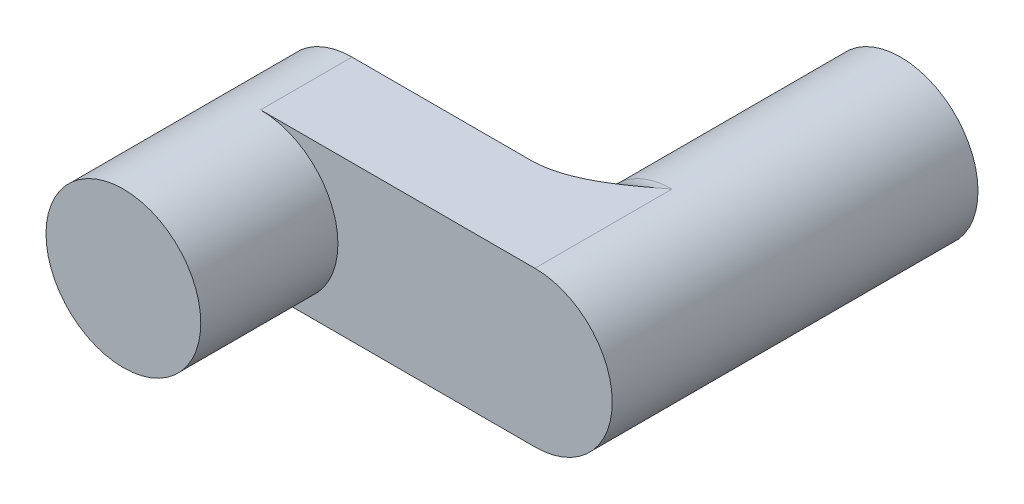
ISO-10303-21;
HEADER;
FILE_DESCRIPTION(('STEP AP214'),'2;1');
FILE_NAME('part.step','',(''),(''),'','','');
FILE_SCHEMA(('AUTOMOTIVE_DESIGN { 1 0 10303 214 1 1 1 1 }'));
ENDSEC;
DATA;
#1=APPLICATION_CONTEXT('core data for automotive mechanical design processes');
#2=APPLICATION_PROTOCOL_DEFINITION('international standard','automotive_design',2000,#1);
#3=PRODUCT_CONTEXT('',#1,'mechanical');
#4=PRODUCT('Part','Part','',(#3));
#5=PRODUCT_RELATED_PRODUCT_CATEGORY('part','',(#4));
#6=PRODUCT_DEFINITION_FORMATION('','',#4);
#7=PRODUCT_DEFINITION_CONTEXT('part definition',#1,'design');
#8=PRODUCT_DEFINITION('design','',#6,#7);
#9=PRODUCT_DEFINITION_SHAPE('','',#8);
#10=(LENGTH_UNIT() NAMED_UNIT(*) SI_UNIT(.MILLI.,.METRE.));
#11=(NAMED_UNIT(*) PLANE_ANGLE_UNIT() SI_UNIT($,.RADIAN.));
#12=(NAMED_UNIT(*) SI_UNIT($,.STERADIAN.) SOLID_ANGLE_UNIT());
#13=UNCERTAINTY_MEASURE_WITH_UNIT(LENGTH_MEASURE(1.E-05),#10,'distance_accuracy_value','');
#14=(GEOMETRIC_REPRESENTATION_CONTEXT(3) GLOBAL_UNCERTAINTY_ASSIGNED_CONTEXT((#13)) GLOBAL_UNIT_ASSIGNED_CONTEXT((#10,
#11,#12)) REPRESENTATION_CONTEXT('',''));
#15=CARTESIAN_POINT('',(0.,0.,0.));
#16=DIRECTION('',(0.,0.,1.));
#17=DIRECTION('',(1.,0.,0.));
#18=AXIS2_PLACEMENT_3D('',#15,#16,#17);
#19=CARTESIAN_POINT('',(0.,0.,30.));
#20=DIRECTION('',(0.,0.,-1.));
#21=DIRECTION('',(-1.,0.,0.));
#22=AXIS2_PLACEMENT_3D('',#19,#20,#21);
#23=CYLINDRICAL_SURFACE('',#22,16.925);
#24=CARTESIAN_POINT('',(0.,0.,30.));
#25=DIRECTION('',(0.,0.,1.));
#26=DIRECTION('',(1.,0.,0.));
#27=AXIS2_PLACEMENT_3D('',#24,#25,#26);
#28=CIRCLE('',#27,16.925);
#29=CARTESIAN_POINT('',(16.925,0.,30.));
#30=VERTEX_POINT('',#29);
#31=EDGE_CURVE('E135',#30,#30,#28,.T.);
#32=ORIENTED_EDGE('',*,*,#31,.F.);
#33=EDGE_LOOP('',(#32));
#34=FACE_BOUND('',#33,.T.);
#35=CARTESIAN_POINT('',(0.,0.,0.));
#36=DIRECTION('',(0.,0.,1.));
#37=DIRECTION('',(1.,0.,0.));
#38=AXIS2_PLACEMENT_3D('',#35,#36,#37);
#39=CIRCLE('',#38,16.925);
#40=CARTESIAN_POINT('',(0.,-16.925,0.));
#41=VERTEX_POINT('',#40);
#42=CARTESIAN_POINT('',(0.,16.9250000042681,0.));
#43=VERTEX_POINT('',#42);
#44=EDGE_CURVE('E120',#41,#43,#39,.T.);
#45=ORIENTED_EDGE('',*,*,#44,.T.);
#46=DIRECTION('',(0.,0.,1.));
#47=VECTOR('',#46,1.);
#48=CARTESIAN_POINT('',(0.,16.9250000042681,-20.));
#49=LINE('',#48,#47);
#50=CARTESIAN_POINT('',(0.,16.9250000042681,-20.));
#51=VERTEX_POINT('',#50);
#52=EDGE_CURVE('E105',#51,#43,#49,.T.);
#53=ORIENTED_EDGE('',*,*,#52,.F.);
#54=CARTESIAN_POINT('',(0.,0.,-20.));
#55=DIRECTION('',(0.,0.,-1.));
#56=DIRECTION('',(-1.,0.,0.));
#57=AXIS2_PLACEMENT_3D('',#54,#55,#56);
#58=CIRCLE('',#57,16.9250000021341);
#59=CARTESIAN_POINT('',(-0.00038009960514479,-16.9249999957319,-20.));
#60=VERTEX_POINT('',#59);
#61=EDGE_CURVE('E106',#60,#51,#58,.T.);
#62=ORIENTED_EDGE('',*,*,#61,.F.);
#63=DIRECTION('',(0.,0.,1.));
#64=VECTOR('',#63,1.);
#65=CARTESIAN_POINT('',(-0.00038009960514479,-16.9249999957319,-20.));
#66=LINE('',#65,#64);
#67=CARTESIAN_POINT('',(-0.00038009960514479,-16.9249999957319,0.));
#68=VERTEX_POINT('',#67);
#69=EDGE_CURVE('E132',#60,#68,#66,.T.);
#70=ORIENTED_EDGE('',*,*,#69,.T.);
#71=EDGE_CURVE('E124',#68,#41,#39,.T.);
#72=ORIENTED_EDGE('',*,*,#71,.T.);
#73=EDGE_LOOP('',(#45,#53,#62,#70,#72));
#74=FACE_BOUND('',#73,.T.);
#75=ADVANCED_FACE('F44',(#34,#74),#23,.T.);
#76=CARTESIAN_POINT('',(0.,0.,30.));
#77=DIRECTION('',(0.,0.,1.));
#78=DIRECTION('',(1.,0.,0.));
#79=AXIS2_PLACEMENT_3D('',#76,#77,#78);
#80=PLANE('',#79);
#81=ORIENTED_EDGE('',*,*,#31,.T.);
#82=EDGE_LOOP('',(#81));
#83=FACE_BOUND('',#82,.T.);
#84=ADVANCED_FACE('F166',(#83),#80,.T.);
#85=CARTESIAN_POINT('',(0.,16.9250000042681,-20.));
#86=DIRECTION('',(0.,-1.,0.));
#87=DIRECTION('',(1.,0.,0.));
#88=AXIS2_PLACEMENT_3D('',#85,#86,#87);
#89=PLANE('',#88);
#90=DIRECTION('',(1.,0.,0.));
#91=VECTOR('',#90,1.);
#92=CARTESIAN_POINT('',(0.,16.9250000042681,0.));
#93=LINE('',#92,#91);
#94=CARTESIAN_POINT('',(60.,16.9250000042681,0.));
#95=VERTEX_POINT('',#94);
#96=EDGE_CURVE('E261',#43,#95,#93,.T.);
#97=ORIENTED_EDGE('',*,*,#96,.T.);
#98=DIRECTION('',(0.,0.,1.));
#99=VECTOR('',#98,1.);
#100=CARTESIAN_POINT('',(60.,16.9250000042681,-20.));
#101=LINE('',#100,#99);
#102=CARTESIAN_POINT('',(60.,16.9250000042681,-30.));
#103=VERTEX_POINT('',#102);
#104=EDGE_CURVE('E118',#103,#95,#101,.T.);
#105=ORIENTED_EDGE('',*,*,#104,.F.);
#106=CARTESIAN_POINT('',(60.,16.9250000042681,-30.));
#107=CARTESIAN_POINT('',(59.7735986586221,16.9250000042681,-29.8269568720035));
#108=CARTESIAN_POINT('',(59.4128240631708,16.9250000042681,-29.5503293658561));
#109=CARTESIAN_POINT('',(58.9414216362641,16.9250000042681,-29.1888768706106));
#110=CARTESIAN_POINT('',(58.8265075606529,16.9250000042681,-29.1008713287725));
#111=CARTESIAN_POINT('',(58.1307169757537,16.9250000042681,-28.5680086041299));
#112=CARTESIAN_POINT('',(57.6518384543623,16.9250000042681,-28.2069626085753));
#113=CARTESIAN_POINT('',(56.3432713052765,16.9250000042681,-27.2203806092008));
#114=CARTESIAN_POINT('',(55.2755358377134,16.9250000042681,-26.4615990363568));
#115=CARTESIAN_POINT('',(53.9957840801528,16.9250000042681,-25.5521490078138));
#116=CARTESIAN_POINT('',(52.8395134613666,16.9250000042681,-24.8099835830408));
#117=CARTESIAN_POINT('',(51.5361109024159,16.9250000042681,-23.9733798519615));
#118=CARTESIAN_POINT('',(50.3120968649346,16.9250000042681,-23.2998328976919));
#119=CARTESIAN_POINT('',(48.9599840347941,16.9250000042681,-22.5557961050716));
#120=CARTESIAN_POINT('',(47.6588781284935,16.9250000042681,-21.9840325701461));
#121=CARTESIAN_POINT('',(46.2563087741847,16.9250000042681,-21.3676815043993));
#122=CARTESIAN_POINT('',(44.8938687435984,16.9250000042681,-20.9430475065135));
#123=CARTESIAN_POINT('',(43.4382901371408,16.9250000042681,-20.4893848505278));
#124=CARTESIAN_POINT('',(42.027658505126,16.9250000042681,-20.2536372010451));
#125=CARTESIAN_POINT('',(40.509982042031,16.9250000042681,-20.));
#126=CARTESIAN_POINT('',(39.0592283045541,16.9250000042681,-20.));
#127=B_SPLINE_CURVE_WITH_KNOTS('',2,(#106,#107,#108,#109,#110,#111,#112,#113,#114,#115,#116,
#117,#118,#119,#120,#121,#122,#123,#124,#125,#126),.UNSPECIFIED.,.F.,.F.,(3,2,2,2,2,2,2,2,2,2,
3),(0.,0.03125,0.0625,0.125,0.25,0.375,0.5,0.625,0.75,0.875,1.),.UNSPECIFIED.);
#128=CARTESIAN_POINT('',(39.0592283045541,16.9250000042681,-20.));
#129=VERTEX_POINT('',#128);
#130=EDGE_CURVE('E60',#103,#129,#127,.T.);
#131=ORIENTED_EDGE('',*,*,#130,.T.);
#132=DIRECTION('',(1.,0.,0.));
#133=VECTOR('',#132,1.);
#134=CARTESIAN_POINT('',(0.,16.9250000042681,-20.));
#135=LINE('',#134,#133);
#136=EDGE_CURVE('E98',#51,#129,#135,.T.);
#137=ORIENTED_EDGE('',*,*,#136,.F.);
#138=ORIENTED_EDGE('',*,*,#52,.T.);
#139=EDGE_LOOP('',(#97,#105,#131,#137,#138));
#140=FACE_BOUND('',#139,.T.);
#141=ADVANCED_FACE('F99',(#140),#89,.F.);
#142=CARTESIAN_POINT('',(59.9996199003949,6.40216271894464E-09,-20.));
#143=DIRECTION('',(0.,0.,1.));
#144=DIRECTION('',(1.,0.,0.));
#145=AXIS2_PLACEMENT_3D('',#142,#143,#144);
#146=CYLINDRICAL_SURFACE('',#145,16.9250000021341);
#147=CARTESIAN_POINT('',(59.9996199003949,6.40216271894464E-09,-30.));
#148=DIRECTION('',(0.,0.,-1.));
#149=DIRECTION('',(-1.,0.,0.));
#150=AXIS2_PLACEMENT_3D('',#147,#148,#149);
#151=CIRCLE('',#150,16.9250000021341);
#152=CARTESIAN_POINT('',(59.9996199003949,-16.9249999957319,-30.));
#153=VERTEX_POINT('',#152);
#154=EDGE_CURVE('E138',#153,#103,#151,.T.);
#155=ORIENTED_EDGE('',*,*,#154,.T.);
#156=ORIENTED_EDGE('',*,*,#104,.T.);
#157=CARTESIAN_POINT('',(59.9996199003949,6.40216271894464E-09,0.));
#158=DIRECTION('',(0.,0.,-1.));
#159=DIRECTION('',(-1.,0.,0.));
#160=AXIS2_PLACEMENT_3D('',#157,#158,#159);
#161=CIRCLE('',#160,16.9250000021341);
#162=CARTESIAN_POINT('',(59.9996199003949,-16.9249999957319,0.));
#163=VERTEX_POINT('',#162);
#164=EDGE_CURVE('E259',#95,#163,#161,.T.);
#165=ORIENTED_EDGE('',*,*,#164,.T.);
#166=DIRECTION('',(0.,0.,1.));
#167=VECTOR('',#166,1.);
#168=CARTESIAN_POINT('',(59.9996199003949,-16.9249999957319,-20.));
#169=LINE('',#168,#167);
#170=EDGE_CURVE('E130',#153,#163,#169,.T.);
#171=ORIENTED_EDGE('',*,*,#170,.F.);
#172=EDGE_LOOP('',(#155,#156,#165,#171));
#173=FACE_BOUND('',#172,.T.);
#174=CARTESIAN_POINT('',(59.9996199003949,-4.74512905937431E-07,-80.));
#175=DIRECTION('',(0.,0.,-1.));
#176=DIRECTION('',(-1.,0.,0.));
#177=AXIS2_PLACEMENT_3D('',#174,#175,#176);
#178=CIRCLE('',#177,16.9250000021341);
#179=CARTESIAN_POINT('',(43.0746198982608,-4.74512905937431E-07,-80.));
#180=VERTEX_POINT('',#179);
#181=EDGE_CURVE('E262',#180,#180,#178,.T.);
#182=ORIENTED_EDGE('',*,*,#181,.F.);
#183=EDGE_LOOP('',(#182));
#184=FACE_BOUND('',#183,.T.);
#185=ADVANCED_FACE('F169',(#173,#184),#146,.T.);
#186=CARTESIAN_POINT('',(59.9996199003949,-16.9249999957319,-20.));
#187=DIRECTION('',(0.,1.,0.));
#188=DIRECTION('',(-1.,0.,0.));
#189=AXIS2_PLACEMENT_3D('',#186,#187,#188);
#190=PLANE('',#189);
#191=DIRECTION('',(-1.,0.,0.));
#192=VECTOR('',#191,1.);
#193=CARTESIAN_POINT('',(59.9996199003949,-16.9249999957319,0.));
#194=LINE('',#193,#192);
#195=EDGE_CURVE('E111',#163,#41,#194,.T.);
#196=ORIENTED_EDGE('',*,*,#195,.T.);
#197=ORIENTED_EDGE('',*,*,#71,.F.);
#198=ORIENTED_EDGE('',*,*,#69,.F.);
#199=DIRECTION('',(-1.,0.,0.));
#200=VECTOR('',#199,1.);
#201=CARTESIAN_POINT('',(59.9996199003949,-16.9249999957319,-20.));
#202=LINE('',#201,#200);
#203=CARTESIAN_POINT('',(39.0592283080038,-16.9249999957319,-20.));
#204=VERTEX_POINT('',#203);
#205=EDGE_CURVE('E104',#204,#60,#202,.T.);
#206=ORIENTED_EDGE('',*,*,#205,.F.);
#207=CARTESIAN_POINT('',(39.0592283080038,-16.9249999957319,-20.));
#208=CARTESIAN_POINT('',(39.6016798701995,-16.9249999957319,-19.9999940432202));
#209=CARTESIAN_POINT('',(40.1436560499173,-16.9249999957319,-20.0266820180531));
#210=CARTESIAN_POINT('',(41.222078841481,-16.9249999957319,-20.1282905558196));
#211=CARTESIAN_POINT('',(41.7585341327669,-16.9249999957319,-20.203117561869));
#212=CARTESIAN_POINT('',(42.8160542151738,-16.9249999957319,-20.3945465574961));
#213=CARTESIAN_POINT('',(43.3372292947613,-16.9249999957319,-20.5105525677982));
#214=CARTESIAN_POINT('',(44.3700671434099,-16.9249999957319,-20.779853560953));
#215=CARTESIAN_POINT('',(44.8817240640439,-16.9249999957319,-20.9331707046838));
#216=CARTESIAN_POINT('',(46.2232259035548,-16.9249999957319,-21.3829965934243));
#217=CARTESIAN_POINT('',(47.0436239061958,-16.9249999957319,-21.7077881659498));
#218=CARTESIAN_POINT('',(48.6525661863369,-16.9249999957319,-22.4281457243768));
#219=CARTESIAN_POINT('',(49.4410916725409,-16.9249999957319,-22.8237527363416));
#220=CARTESIAN_POINT('',(50.9934418215709,-16.9249999957319,-23.6722343334456));
#221=CARTESIAN_POINT('',(51.7570581041424,-16.9249999957319,-24.1254858163792));
#222=CARTESIAN_POINT('',(53.2583253365073,-16.9249999957319,-25.0723587446798));
#223=CARTESIAN_POINT('',(53.9959805927396,-16.9249999957319,-25.5659734489797));
#224=CARTESIAN_POINT('',(55.6206260228603,-16.9249999957319,-26.6983402310413));
#225=CARTESIAN_POINT('',(56.5025978988604,-16.9249999957319,-27.3442130562365));
#226=CARTESIAN_POINT('',(58.2493762564615,-16.9249999957319,-28.6547745479911));
#227=CARTESIAN_POINT('',(59.1142138229605,-16.9249999957319,-29.3194225560102));
#228=CARTESIAN_POINT('',(59.9858671501034,-16.9249999957319,-29.9894287777528));
#229=CARTESIAN_POINT('',(59.9927435252531,-16.9249999957319,-29.9947143890841));
#230=CARTESIAN_POINT('',(59.9996199003948,-16.9249999957319,-30.));
#231=B_SPLINE_CURVE_WITH_KNOTS('',3,(#207,#208,#209,#210,#211,#212,#213,#214,#215,#216,#217,
#218,#219,#220,#221,#222,#223,#224,#225,#226,#227,#228,#229,#230),.UNSPECIFIED.,.F.,.F.,(4,2,2,
2,2,2,2,2,2,2,2,4),(0.,1.62601171323252,3.24887282489572,4.84914472577659,6.45036943492069,
9.09282414042655,11.7368147039182,14.3990787307932,17.0608990371608,20.3397154754682,
23.6119063905015,23.6379256141667),.UNSPECIFIED.);
#232=EDGE_CURVE('E11',#204,#153,#231,.T.);
#233=ORIENTED_EDGE('',*,*,#232,.T.);
#234=ORIENTED_EDGE('',*,*,#170,.T.);
#235=EDGE_LOOP('',(#196,#197,#198,#206,#233,#234));
#236=FACE_BOUND('',#235,.T.);
#237=ADVANCED_FACE('F215',(#236),#190,.F.);
#238=CARTESIAN_POINT('',(0.,0.,-20.));
#239=DIRECTION('',(0.,0.,-1.));
#240=DIRECTION('',(-1.,0.,0.));
#241=AXIS2_PLACEMENT_3D('',#238,#239,#240);
#242=PLANE('',#241);
#243=ORIENTED_EDGE('',*,*,#136,.T.);
#244=CARTESIAN_POINT('',(59.9996199003949,6.40216271894464E-09,-20.));
#245=DIRECTION('',(0.,0.,-1.));
#246=DIRECTION('',(-1.,0.,0.));
#247=AXIS2_PLACEMENT_3D('',#244,#245,#246);
#248=CIRCLE('',#247,26.9250000021341);
#249=EDGE_CURVE('E75',#129,#204,#248,.F.);
#250=ORIENTED_EDGE('',*,*,#249,.T.);
#251=ORIENTED_EDGE('',*,*,#205,.T.);
#252=ORIENTED_EDGE('',*,*,#61,.T.);
#253=EDGE_LOOP('',(#243,#250,#251,#252));
#254=FACE_BOUND('',#253,.T.);
#255=ADVANCED_FACE('F108',(#254),#242,.T.);
#256=CARTESIAN_POINT('',(0.,0.,0.));
#257=DIRECTION('',(0.,0.,-1.));
#258=DIRECTION('',(-1.,0.,0.));
#259=AXIS2_PLACEMENT_3D('',#256,#257,#258);
#260=PLANE('',#259);
#261=ORIENTED_EDGE('',*,*,#44,.F.);
#262=ORIENTED_EDGE('',*,*,#195,.F.);
#263=ORIENTED_EDGE('',*,*,#164,.F.);
#264=ORIENTED_EDGE('',*,*,#96,.F.);
#265=EDGE_LOOP('',(#261,#262,#263,#264));
#266=FACE_BOUND('',#265,.T.);
#267=ADVANCED_FACE('F184',(#266),#260,.F.);
#268=CARTESIAN_POINT('',(59.9996199003949,-4.74512905937431E-07,-80.));
#269=DIRECTION('',(0.,0.,-1.));
#270=DIRECTION('',(-1.,0.,0.));
#271=AXIS2_PLACEMENT_3D('',#268,#269,#270);
#272=PLANE('',#271);
#273=ORIENTED_EDGE('',*,*,#181,.T.);
#274=EDGE_LOOP('',(#273));
#275=FACE_BOUND('',#274,.T.);
#276=ADVANCED_FACE('F190',(#275),#272,.T.);
#277=CARTESIAN_POINT('',(59.9996199003949,6.40216271894464E-09,-30.));
#278=DIRECTION('',(0.,0.,-1.));
#279=DIRECTION('',(-1.,0.,0.));
#280=AXIS2_PLACEMENT_3D('',#277,#278,#279);
#281=TOROIDAL_SURFACE('',#280,26.9250000021341,10.);
#282=ORIENTED_EDGE('',*,*,#232,.F.);
#283=ORIENTED_EDGE('',*,*,#249,.F.);
#284=ORIENTED_EDGE('',*,*,#130,.F.);
#285=ORIENTED_EDGE('',*,*,#154,.F.);
#286=EDGE_LOOP('',(#282,#283,#284,#285));
#287=FACE_BOUND('',#286,.T.);
#288=ADVANCED_FACE('F50',(#287),#281,.F.);
#289=CLOSED_SHELL('',(#75,#84,#141,#185,#237,#255,#267,#276,#288));
#290=MANIFOLD_SOLID_BREP('B2',#289);
#291=ADVANCED_BREP_SHAPE_REPRESENTATION('',(#18,#290),#14);
#292=SHAPE_DEFINITION_REPRESENTATION(#9,#291);
ENDSEC;
END-ISO-10303-21;
